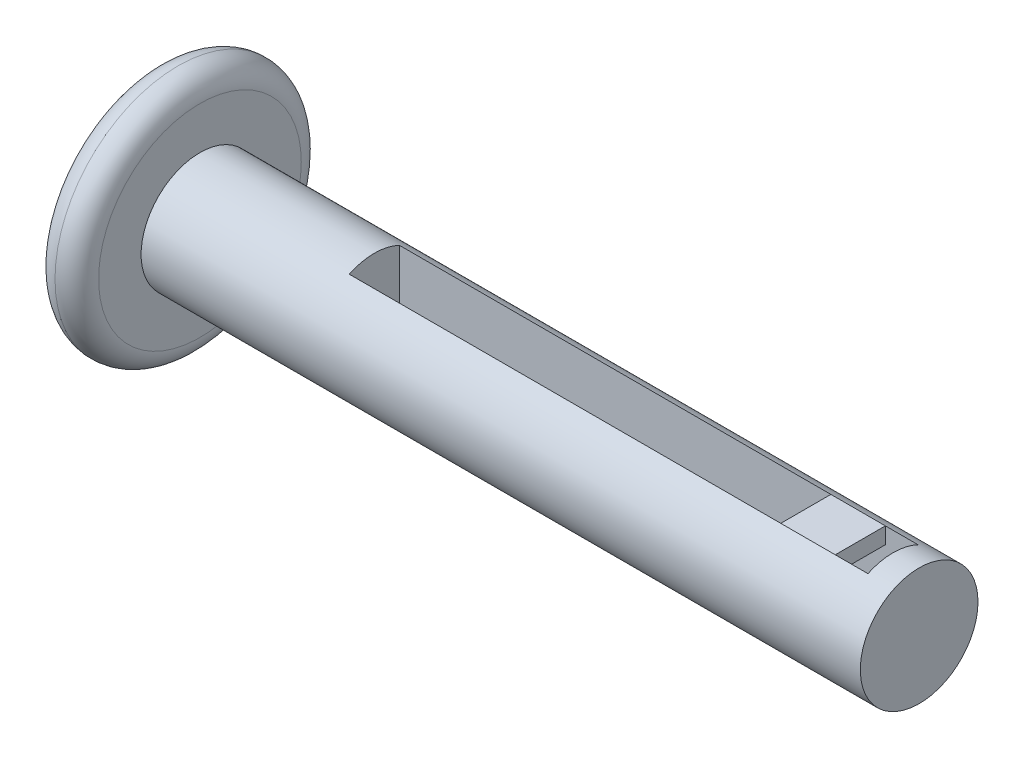
ISO-10303-21;
HEADER;
FILE_DESCRIPTION(('STEP AP214'),'2;1');
FILE_NAME('part.step','',(''),(''),'','','');
FILE_SCHEMA(('AUTOMOTIVE_DESIGN { 1 0 10303 214 1 1 1 1 }'));
ENDSEC;
DATA;
#1=APPLICATION_CONTEXT('core data for automotive mechanical design processes');
#2=APPLICATION_PROTOCOL_DEFINITION('international standard','automotive_design',2000,#1);
#3=PRODUCT_CONTEXT('',#1,'mechanical');
#4=PRODUCT('Part','Part','',(#3));
#5=PRODUCT_RELATED_PRODUCT_CATEGORY('part','',(#4));
#6=PRODUCT_DEFINITION_FORMATION('','',#4);
#7=PRODUCT_DEFINITION_CONTEXT('part definition',#1,'design');
#8=PRODUCT_DEFINITION('design','',#6,#7);
#9=PRODUCT_DEFINITION_SHAPE('','',#8);
#10=(LENGTH_UNIT() NAMED_UNIT(*) SI_UNIT(.MILLI.,.METRE.));
#11=(NAMED_UNIT(*) PLANE_ANGLE_UNIT() SI_UNIT($,.RADIAN.));
#12=(NAMED_UNIT(*) SI_UNIT($,.STERADIAN.) SOLID_ANGLE_UNIT());
#13=UNCERTAINTY_MEASURE_WITH_UNIT(LENGTH_MEASURE(1.E-05),#10,'distance_accuracy_value','');
#14=(GEOMETRIC_REPRESENTATION_CONTEXT(3) GLOBAL_UNCERTAINTY_ASSIGNED_CONTEXT((#13)) GLOBAL_UNIT_ASSIGNED_CONTEXT((#10,
#11,#12)) REPRESENTATION_CONTEXT('',''));
#15=CARTESIAN_POINT('',(0.,0.,0.));
#16=DIRECTION('',(0.,0.,1.));
#17=DIRECTION('',(1.,0.,0.));
#18=AXIS2_PLACEMENT_3D('',#15,#16,#17);
#19=CARTESIAN_POINT('',(335.355946514972,0.396457167122398,0.));
#20=DIRECTION('',(1.,0.,0.));
#21=DIRECTION('',(0.,0.,-1.));
#22=AXIS2_PLACEMENT_3D('',#19,#20,#21);
#23=PLANE('',#22);
#24=CARTESIAN_POINT('',(335.355946514972,0.396457167122398,0.));
#25=DIRECTION('',(1.,0.,0.));
#26=DIRECTION('',(0.,0.,-1.));
#27=AXIS2_PLACEMENT_3D('',#24,#25,#26);
#28=CIRCLE('',#27,5.9055);
#29=CARTESIAN_POINT('',(335.355946514972,0.396457167122398,-5.90549999999999));
#30=VERTEX_POINT('',#29);
#31=EDGE_CURVE('E11',#30,#30,#28,.T.);
#32=ORIENTED_EDGE('',*,*,#31,.T.);
#33=EDGE_LOOP('',(#32));
#34=FACE_BOUND('',#33,.T.);
#35=CARTESIAN_POINT('',(335.355946514972,0.396457167122398,0.));
#36=DIRECTION('',(1.,0.,0.));
#37=DIRECTION('',(0.,0.,-1.));
#38=AXIS2_PLACEMENT_3D('',#35,#36,#37);
#39=CIRCLE('',#38,3.429);
#40=CARTESIAN_POINT('',(335.355946514972,0.396457167122398,-3.42899999999999));
#41=VERTEX_POINT('',#40);
#42=EDGE_CURVE('E134',#41,#41,#39,.T.);
#43=ORIENTED_EDGE('',*,*,#42,.F.);
#44=EDGE_LOOP('',(#43));
#45=FACE_BOUND('',#44,.T.);
#46=ADVANCED_FACE('F34',(#34,#45),#23,.T.);
#47=CARTESIAN_POINT('',(332.815946514972,0.396457167122398,0.));
#48=DIRECTION('',(1.,0.,0.));
#49=DIRECTION('',(0.,0.,-1.));
#50=AXIS2_PLACEMENT_3D('',#47,#48,#49);
#51=PLANE('',#50);
#52=CARTESIAN_POINT('',(332.815946514972,0.396457167122398,0.));
#53=DIRECTION('',(1.,0.,0.));
#54=DIRECTION('',(0.,0.,-1.));
#55=AXIS2_PLACEMENT_3D('',#52,#53,#54);
#56=CIRCLE('',#55,5.9055);
#57=CARTESIAN_POINT('',(332.815946514972,0.396457167122398,-5.90549999999999));
#58=VERTEX_POINT('',#57);
#59=EDGE_CURVE('E43',#58,#58,#56,.F.);
#60=ORIENTED_EDGE('',*,*,#59,.T.);
#61=EDGE_LOOP('',(#60));
#62=FACE_BOUND('',#61,.T.);
#63=CARTESIAN_POINT('',(332.815946514972,0.396457167122398,0.));
#64=DIRECTION('',(-1.,0.,0.));
#65=DIRECTION('',(0.,0.,1.));
#66=AXIS2_PLACEMENT_3D('',#63,#64,#65);
#67=CIRCLE('',#66,2.54);
#68=CARTESIAN_POINT('',(332.815946514972,0.396457167122398,2.54000000000001));
#69=VERTEX_POINT('',#68);
#70=EDGE_CURVE('E179',#69,#69,#67,.T.);
#71=ORIENTED_EDGE('',*,*,#70,.F.);
#72=EDGE_LOOP('',(#71));
#73=FACE_BOUND('',#72,.T.);
#74=ADVANCED_FACE('F219',(#62,#73),#51,.F.);
#75=CARTESIAN_POINT('',(377.265946514972,0.396457167122398,0.));
#76=DIRECTION('',(-1.,0.,0.));
#77=DIRECTION('',(0.,0.,1.));
#78=AXIS2_PLACEMENT_3D('',#75,#76,#77);
#79=CYLINDRICAL_SURFACE('',#78,3.429);
#80=DIRECTION('',(-1.,0.,0.));
#81=VECTOR('',#80,1.);
#82=CARTESIAN_POINT('',(377.265946514972,-2.70595814195536,1.46050000000001));
#83=LINE('',#82,#81);
#84=CARTESIAN_POINT('',(345.515946514972,-2.70595814195535,1.46050000000001));
#85=VERTEX_POINT('',#84);
#86=CARTESIAN_POINT('',(375.741946514972,-2.70595814195536,1.46050000000001));
#87=VERTEX_POINT('',#86);
#88=EDGE_CURVE('E148',#85,#87,#83,.F.);
#89=ORIENTED_EDGE('',*,*,#88,.T.);
#90=CARTESIAN_POINT('',(375.741946514972,0.396457167122398,0.));
#91=DIRECTION('',(1.,0.,0.));
#92=DIRECTION('',(0.,0.,-1.));
#93=AXIS2_PLACEMENT_3D('',#90,#91,#92);
#94=CIRCLE('',#93,3.429);
#95=CARTESIAN_POINT('',(375.741946514972,-2.70595814195535,-1.46049999999999));
#96=VERTEX_POINT('',#95);
#97=EDGE_CURVE('E145',#87,#96,#94,.T.);
#98=ORIENTED_EDGE('',*,*,#97,.T.);
#99=DIRECTION('',(-1.,0.,0.));
#100=VECTOR('',#99,1.);
#101=CARTESIAN_POINT('',(377.265946514972,-2.70595814195535,-1.46049999999999));
#102=LINE('',#101,#100);
#103=CARTESIAN_POINT('',(345.515946514972,-2.70595814195535,-1.46049999999999));
#104=VERTEX_POINT('',#103);
#105=EDGE_CURVE('E144',#96,#104,#102,.T.);
#106=ORIENTED_EDGE('',*,*,#105,.T.);
#107=CARTESIAN_POINT('',(345.515946514972,0.396457167122398,0.));
#108=DIRECTION('',(-1.,0.,0.));
#109=DIRECTION('',(0.,0.,1.));
#110=AXIS2_PLACEMENT_3D('',#107,#108,#109);
#111=CIRCLE('',#110,3.429);
#112=EDGE_CURVE('E133',#104,#85,#111,.T.);
#113=ORIENTED_EDGE('',*,*,#112,.T.);
#114=EDGE_LOOP('',(#89,#98,#106,#113));
#115=FACE_BOUND('',#114,.T.);
#116=DIRECTION('',(-1.,0.,0.));
#117=VECTOR('',#116,1.);
#118=CARTESIAN_POINT('',(377.265946514972,3.49887247620015,-1.46049999999999));
#119=LINE('',#118,#117);
#120=CARTESIAN_POINT('',(345.515946514972,3.49887247620015,-1.46049999999999));
#121=VERTEX_POINT('',#120);
#122=CARTESIAN_POINT('',(370.661946514972,3.49887247620015,-1.46049999999999));
#123=VERTEX_POINT('',#122);
#124=EDGE_CURVE('E119',#121,#123,#119,.F.);
#125=ORIENTED_EDGE('',*,*,#124,.T.);
#126=DIRECTION('',(-1.,0.,0.));
#127=VECTOR('',#126,1.);
#128=CARTESIAN_POINT('',(373.836946514972,3.49887247620015,-1.46049999999999));
#129=LINE('',#128,#127);
#130=CARTESIAN_POINT('',(373.836946514972,3.49887247620015,-1.46049999999999));
#131=VERTEX_POINT('',#130);
#132=EDGE_CURVE('E111',#131,#123,#129,.T.);
#133=ORIENTED_EDGE('',*,*,#132,.F.);
#134=CARTESIAN_POINT('',(375.741946514972,3.49887247620015,-1.46049999999999));
#135=VERTEX_POINT('',#134);
#136=EDGE_CURVE('E129',#131,#135,#119,.F.);
#137=ORIENTED_EDGE('',*,*,#136,.T.);
#138=CARTESIAN_POINT('',(375.741946514972,3.49887247620015,1.46050000000001));
#139=VERTEX_POINT('',#138);
#140=EDGE_CURVE('E141',#135,#139,#94,.T.);
#141=ORIENTED_EDGE('',*,*,#140,.T.);
#142=DIRECTION('',(-1.,0.,0.));
#143=VECTOR('',#142,1.);
#144=CARTESIAN_POINT('',(377.265946514972,3.49887247620015,1.46050000000001));
#145=LINE('',#144,#143);
#146=CARTESIAN_POINT('',(373.836946514972,3.49887247620015,1.46050000000001));
#147=VERTEX_POINT('',#146);
#148=EDGE_CURVE('E138',#139,#147,#145,.T.);
#149=ORIENTED_EDGE('',*,*,#148,.T.);
#150=DIRECTION('',(-1.,0.,0.));
#151=VECTOR('',#150,1.);
#152=CARTESIAN_POINT('',(373.836946514972,3.49887247620015,1.46050000000001));
#153=LINE('',#152,#151);
#154=CARTESIAN_POINT('',(370.661946514972,3.49887247620015,1.46050000000001));
#155=VERTEX_POINT('',#154);
#156=EDGE_CURVE('E196',#147,#155,#153,.T.);
#157=ORIENTED_EDGE('',*,*,#156,.T.);
#158=CARTESIAN_POINT('',(345.515946514972,3.49887247620015,1.46050000000001));
#159=VERTEX_POINT('',#158);
#160=EDGE_CURVE('E131',#155,#159,#145,.T.);
#161=ORIENTED_EDGE('',*,*,#160,.T.);
#162=EDGE_CURVE('E128',#159,#121,#111,.T.);
#163=ORIENTED_EDGE('',*,*,#162,.T.);
#164=EDGE_LOOP('',(#125,#133,#137,#141,#149,#157,#161,#163));
#165=FACE_BOUND('',#164,.T.);
#166=CARTESIAN_POINT('',(377.265946514972,0.396457167122398,0.));
#167=DIRECTION('',(1.,0.,0.));
#168=DIRECTION('',(0.,0.,-1.));
#169=AXIS2_PLACEMENT_3D('',#166,#167,#168);
#170=CIRCLE('',#169,3.429);
#171=CARTESIAN_POINT('',(377.265946514972,0.396457167122398,-3.42899999999999));
#172=VERTEX_POINT('',#171);
#173=EDGE_CURVE('E172',#172,#172,#170,.T.);
#174=ORIENTED_EDGE('',*,*,#173,.F.);
#175=EDGE_LOOP('',(#174));
#176=FACE_BOUND('',#175,.T.);
#177=ORIENTED_EDGE('',*,*,#42,.T.);
#178=EDGE_LOOP('',(#177));
#179=FACE_BOUND('',#178,.T.);
#180=ADVANCED_FACE('F125',(#115,#165,#176,#179),#79,.T.);
#181=CARTESIAN_POINT('',(377.265946514972,0.396457167122398,0.));
#182=DIRECTION('',(1.,0.,0.));
#183=DIRECTION('',(0.,0.,-1.));
#184=AXIS2_PLACEMENT_3D('',#181,#182,#183);
#185=PLANE('',#184);
#186=ORIENTED_EDGE('',*,*,#173,.T.);
#187=EDGE_LOOP('',(#186));
#188=FACE_BOUND('',#187,.T.);
#189=ADVANCED_FACE('F299',(#188),#185,.T.);
#190=CARTESIAN_POINT('',(375.741946514972,-6.7790428328776,1.46050000000001));
#191=DIRECTION('',(1.,0.,0.));
#192=DIRECTION('',(0.,0.,-1.));
#193=AXIS2_PLACEMENT_3D('',#190,#191,#192);
#194=PLANE('',#193);
#195=DIRECTION('',(0.,1.,0.));
#196=VECTOR('',#195,1.);
#197=CARTESIAN_POINT('',(375.741946514972,-6.7790428328776,-1.46049999999999));
#198=LINE('',#197,#196);
#199=EDGE_CURVE('E165',#96,#135,#198,.T.);
#200=ORIENTED_EDGE('',*,*,#199,.F.);
#201=ORIENTED_EDGE('',*,*,#97,.F.);
#202=DIRECTION('',(0.,1.,0.));
#203=VECTOR('',#202,1.);
#204=CARTESIAN_POINT('',(375.741946514972,-6.7790428328776,1.46050000000001));
#205=LINE('',#204,#203);
#206=EDGE_CURVE('E163',#87,#139,#205,.T.);
#207=ORIENTED_EDGE('',*,*,#206,.T.);
#208=ORIENTED_EDGE('',*,*,#140,.F.);
#209=EDGE_LOOP('',(#200,#201,#207,#208));
#210=FACE_BOUND('',#209,.T.);
#211=ADVANCED_FACE('F161',(#210),#194,.F.);
#212=CARTESIAN_POINT('',(345.515946514972,-6.7790428328776,1.46050000000001));
#213=DIRECTION('',(0.,0.,1.));
#214=DIRECTION('',(1.,0.,0.));
#215=AXIS2_PLACEMENT_3D('',#212,#213,#214);
#216=PLANE('',#215);
#217=DIRECTION('',(1.,0.,0.));
#218=VECTOR('',#217,1.);
#219=CARTESIAN_POINT('',(373.836946514972,2.54637247620015,1.46050000000001));
#220=LINE('',#219,#218);
#221=CARTESIAN_POINT('',(370.661946514972,2.54637247620015,1.46050000000001));
#222=VERTEX_POINT('',#221);
#223=CARTESIAN_POINT('',(373.836946514972,2.54637247620015,1.46050000000001));
#224=VERTEX_POINT('',#223);
#225=EDGE_CURVE('E193',#222,#224,#220,.T.);
#226=ORIENTED_EDGE('',*,*,#225,.T.);
#227=DIRECTION('',(0.,1.,0.));
#228=VECTOR('',#227,1.);
#229=CARTESIAN_POINT('',(373.836946514972,3.49887247620015,1.46050000000001));
#230=LINE('',#229,#228);
#231=EDGE_CURVE('E199',#224,#147,#230,.T.);
#232=ORIENTED_EDGE('',*,*,#231,.T.);
#233=ORIENTED_EDGE('',*,*,#148,.F.);
#234=ORIENTED_EDGE('',*,*,#206,.F.);
#235=ORIENTED_EDGE('',*,*,#88,.F.);
#236=DIRECTION('',(0.,1.,0.));
#237=VECTOR('',#236,1.);
#238=CARTESIAN_POINT('',(345.515946514972,-6.7790428328776,1.46050000000001));
#239=LINE('',#238,#237);
#240=EDGE_CURVE('E173',#85,#159,#239,.T.);
#241=ORIENTED_EDGE('',*,*,#240,.T.);
#242=ORIENTED_EDGE('',*,*,#160,.F.);
#243=DIRECTION('',(0.,-1.,0.));
#244=VECTOR('',#243,1.);
#245=CARTESIAN_POINT('',(370.661946514972,3.49887247620015,1.46050000000001));
#246=LINE('',#245,#244);
#247=EDGE_CURVE('E50',#155,#222,#246,.T.);
#248=ORIENTED_EDGE('',*,*,#247,.T.);
#249=EDGE_LOOP('',(#226,#232,#233,#234,#235,#241,#242,#248));
#250=FACE_BOUND('',#249,.T.);
#251=ADVANCED_FACE('F168',(#250),#216,.F.);
#252=CARTESIAN_POINT('',(345.515946514972,-6.7790428328776,1.46050000000001));
#253=DIRECTION('',(-1.,0.,0.));
#254=DIRECTION('',(0.,0.,1.));
#255=AXIS2_PLACEMENT_3D('',#252,#253,#254);
#256=PLANE('',#255);
#257=ORIENTED_EDGE('',*,*,#240,.F.);
#258=ORIENTED_EDGE('',*,*,#112,.F.);
#259=DIRECTION('',(0.,1.,0.));
#260=VECTOR('',#259,1.);
#261=CARTESIAN_POINT('',(345.515946514972,-6.7790428328776,-1.46049999999999));
#262=LINE('',#261,#260);
#263=EDGE_CURVE('E176',#104,#121,#262,.T.);
#264=ORIENTED_EDGE('',*,*,#263,.T.);
#265=ORIENTED_EDGE('',*,*,#162,.F.);
#266=EDGE_LOOP('',(#257,#258,#264,#265));
#267=FACE_BOUND('',#266,.T.);
#268=ADVANCED_FACE('F321',(#267),#256,.F.);
#269=CARTESIAN_POINT('',(345.515946514972,-6.7790428328776,-1.46049999999999));
#270=DIRECTION('',(0.,0.,-1.));
#271=DIRECTION('',(-1.,0.,0.));
#272=AXIS2_PLACEMENT_3D('',#269,#270,#271);
#273=PLANE('',#272);
#274=ORIENTED_EDGE('',*,*,#136,.F.);
#275=DIRECTION('',(0.,1.,0.));
#276=VECTOR('',#275,1.);
#277=CARTESIAN_POINT('',(373.836946514972,3.49887247620015,-1.46049999999999));
#278=LINE('',#277,#276);
#279=CARTESIAN_POINT('',(373.836946514972,2.54637247620015,-1.46049999999999));
#280=VERTEX_POINT('',#279);
#281=EDGE_CURVE('E58',#280,#131,#278,.T.);
#282=ORIENTED_EDGE('',*,*,#281,.F.);
#283=DIRECTION('',(1.,0.,0.));
#284=VECTOR('',#283,1.);
#285=CARTESIAN_POINT('',(373.836946514972,2.54637247620015,-1.46049999999999));
#286=LINE('',#285,#284);
#287=CARTESIAN_POINT('',(370.661946514972,2.54637247620015,-1.46049999999999));
#288=VERTEX_POINT('',#287);
#289=EDGE_CURVE('E122',#288,#280,#286,.T.);
#290=ORIENTED_EDGE('',*,*,#289,.F.);
#291=DIRECTION('',(0.,-1.,0.));
#292=VECTOR('',#291,1.);
#293=CARTESIAN_POINT('',(370.661946514972,3.49887247620015,-1.46049999999999));
#294=LINE('',#293,#292);
#295=EDGE_CURVE('E102',#123,#288,#294,.T.);
#296=ORIENTED_EDGE('',*,*,#295,.F.);
#297=ORIENTED_EDGE('',*,*,#124,.F.);
#298=ORIENTED_EDGE('',*,*,#263,.F.);
#299=ORIENTED_EDGE('',*,*,#105,.F.);
#300=ORIENTED_EDGE('',*,*,#199,.T.);
#301=EDGE_LOOP('',(#274,#282,#290,#296,#297,#298,#299,#300));
#302=FACE_BOUND('',#301,.T.);
#303=ADVANCED_FACE('F118',(#302),#273,.F.);
#304=CARTESIAN_POINT('',(344.626946514972,0.396457167122398,0.));
#305=DIRECTION('',(-1.,0.,0.));
#306=DIRECTION('',(0.,0.,1.));
#307=AXIS2_PLACEMENT_3D('',#304,#305,#306);
#308=CYLINDRICAL_SURFACE('',#307,2.54);
#309=CARTESIAN_POINT('',(344.626946514972,0.396457167122398,0.));
#310=DIRECTION('',(-1.,0.,0.));
#311=DIRECTION('',(0.,0.,1.));
#312=AXIS2_PLACEMENT_3D('',#309,#310,#311);
#313=CIRCLE('',#312,2.54);
#314=CARTESIAN_POINT('',(344.626946514972,0.396457167122398,2.54000000000001));
#315=VERTEX_POINT('',#314);
#316=EDGE_CURVE('E183',#315,#315,#313,.T.);
#317=ORIENTED_EDGE('',*,*,#316,.F.);
#318=EDGE_LOOP('',(#317));
#319=FACE_BOUND('',#318,.T.);
#320=ORIENTED_EDGE('',*,*,#70,.T.);
#321=EDGE_LOOP('',(#320));
#322=FACE_BOUND('',#321,.T.);
#323=ADVANCED_FACE('F215',(#319,#322),#308,.F.);
#324=CARTESIAN_POINT('',(344.626946514972,0.396457167122398,0.));
#325=DIRECTION('',(-1.,0.,0.));
#326=DIRECTION('',(0.,0.,1.));
#327=AXIS2_PLACEMENT_3D('',#324,#325,#326);
#328=PLANE('',#327);
#329=ORIENTED_EDGE('',*,*,#316,.T.);
#330=EDGE_LOOP('',(#329));
#331=FACE_BOUND('',#330,.T.);
#332=ADVANCED_FACE('F208',(#331),#328,.T.);
#333=CARTESIAN_POINT('',(373.836946514972,3.49887247620015,-1.46049999999999));
#334=DIRECTION('',(1.,0.,0.));
#335=DIRECTION('',(0.,0.,-1.));
#336=AXIS2_PLACEMENT_3D('',#333,#334,#335);
#337=PLANE('',#336);
#338=ORIENTED_EDGE('',*,*,#231,.F.);
#339=DIRECTION('',(0.,0.,1.));
#340=VECTOR('',#339,1.);
#341=CARTESIAN_POINT('',(373.836946514972,2.54637247620015,-1.46049999999999));
#342=LINE('',#341,#340);
#343=EDGE_CURVE('E188',#280,#224,#342,.T.);
#344=ORIENTED_EDGE('',*,*,#343,.F.);
#345=ORIENTED_EDGE('',*,*,#281,.T.);
#346=DIRECTION('',(0.,0.,1.));
#347=VECTOR('',#346,1.);
#348=CARTESIAN_POINT('',(373.836946514972,3.49887247620015,-1.46049999999999));
#349=LINE('',#348,#347);
#350=EDGE_CURVE('E108',#131,#147,#349,.T.);
#351=ORIENTED_EDGE('',*,*,#350,.T.);
#352=EDGE_LOOP('',(#338,#344,#345,#351));
#353=FACE_BOUND('',#352,.T.);
#354=ADVANCED_FACE('F206',(#353),#337,.T.);
#355=CARTESIAN_POINT('',(373.836946514972,2.54637247620015,-1.46049999999999));
#356=DIRECTION('',(0.,-1.,0.));
#357=DIRECTION('',(1.,0.,0.));
#358=AXIS2_PLACEMENT_3D('',#355,#356,#357);
#359=PLANE('',#358);
#360=ORIENTED_EDGE('',*,*,#225,.F.);
#361=DIRECTION('',(0.,0.,1.));
#362=VECTOR('',#361,1.);
#363=CARTESIAN_POINT('',(370.661946514972,2.54637247620015,-1.46049999999999));
#364=LINE('',#363,#362);
#365=EDGE_CURVE('E107',#288,#222,#364,.T.);
#366=ORIENTED_EDGE('',*,*,#365,.F.);
#367=ORIENTED_EDGE('',*,*,#289,.T.);
#368=ORIENTED_EDGE('',*,*,#343,.T.);
#369=EDGE_LOOP('',(#360,#366,#367,#368));
#370=FACE_BOUND('',#369,.T.);
#371=ADVANCED_FACE('F204',(#370),#359,.T.);
#372=CARTESIAN_POINT('',(370.661946514972,3.49887247620015,-1.46049999999999));
#373=DIRECTION('',(-1.,0.,0.));
#374=DIRECTION('',(0.,0.,1.));
#375=AXIS2_PLACEMENT_3D('',#372,#373,#374);
#376=PLANE('',#375);
#377=ORIENTED_EDGE('',*,*,#247,.F.);
#378=DIRECTION('',(0.,0.,1.));
#379=VECTOR('',#378,1.);
#380=CARTESIAN_POINT('',(370.661946514972,3.49887247620015,-1.46049999999999));
#381=LINE('',#380,#379);
#382=EDGE_CURVE('E98',#123,#155,#381,.T.);
#383=ORIENTED_EDGE('',*,*,#382,.F.);
#384=ORIENTED_EDGE('',*,*,#295,.T.);
#385=ORIENTED_EDGE('',*,*,#365,.T.);
#386=EDGE_LOOP('',(#377,#383,#384,#385));
#387=FACE_BOUND('',#386,.T.);
#388=ADVANCED_FACE('F100',(#387),#376,.T.);
#389=CARTESIAN_POINT('',(373.836946514972,3.49887247620015,-1.46049999999999));
#390=DIRECTION('',(0.,1.,0.));
#391=DIRECTION('',(0.,0.,1.));
#392=AXIS2_PLACEMENT_3D('',#389,#390,#391);
#393=PLANE('',#392);
#394=ORIENTED_EDGE('',*,*,#156,.F.);
#395=ORIENTED_EDGE('',*,*,#350,.F.);
#396=ORIENTED_EDGE('',*,*,#132,.T.);
#397=ORIENTED_EDGE('',*,*,#382,.T.);
#398=EDGE_LOOP('',(#394,#395,#396,#397));
#399=FACE_BOUND('',#398,.T.);
#400=ADVANCED_FACE('F112',(#399),#393,.T.);
#401=CARTESIAN_POINT('',(334.085946514972,0.396457167122398,0.));
#402=DIRECTION('',(1.,0.,0.));
#403=DIRECTION('',(0.,0.,-1.));
#404=AXIS2_PLACEMENT_3D('',#401,#402,#403);
#405=TOROIDAL_SURFACE('',#404,5.9055,1.27);
#406=ORIENTED_EDGE('',*,*,#31,.F.);
#407=EDGE_LOOP('',(#406));
#408=FACE_BOUND('',#407,.T.);
#409=CARTESIAN_POINT('',(334.085946514972,0.396457167122398,0.));
#410=DIRECTION('',(1.,0.,0.));
#411=DIRECTION('',(0.,0.,-1.));
#412=AXIS2_PLACEMENT_3D('',#409,#410,#411);
#413=CIRCLE('',#412,7.1755);
#414=CARTESIAN_POINT('',(334.085946514972,0.396457167122398,-7.17549999999999));
#415=VERTEX_POINT('',#414);
#416=EDGE_CURVE('E38',#415,#415,#413,.F.);
#417=ORIENTED_EDGE('',*,*,#416,.F.);
#418=EDGE_LOOP('',(#417));
#419=FACE_BOUND('',#418,.T.);
#420=ADVANCED_FACE('F36',(#408,#419),#405,.T.);
#421=CARTESIAN_POINT('',(334.085946514972,0.396457167122398,0.));
#422=DIRECTION('',(1.,0.,0.));
#423=DIRECTION('',(0.,0.,-1.));
#424=AXIS2_PLACEMENT_3D('',#421,#422,#423);
#425=TOROIDAL_SURFACE('',#424,5.9055,1.27);
#426=ORIENTED_EDGE('',*,*,#59,.F.);
#427=EDGE_LOOP('',(#426));
#428=FACE_BOUND('',#427,.T.);
#429=ORIENTED_EDGE('',*,*,#416,.T.);
#430=EDGE_LOOP('',(#429));
#431=FACE_BOUND('',#430,.T.);
#432=ADVANCED_FACE('F229',(#428,#431),#425,.T.);
#433=CLOSED_SHELL('',(#46,#74,#180,#189,#211,#251,#268,#303,#323,#332,#354,#371,#388,#400,#420,#432));
#434=MANIFOLD_SOLID_BREP('B2',#433);
#435=ADVANCED_BREP_SHAPE_REPRESENTATION('',(#18,#434),#14);
#436=SHAPE_DEFINITION_REPRESENTATION(#9,#435);
ENDSEC;
END-ISO-10303-21;
